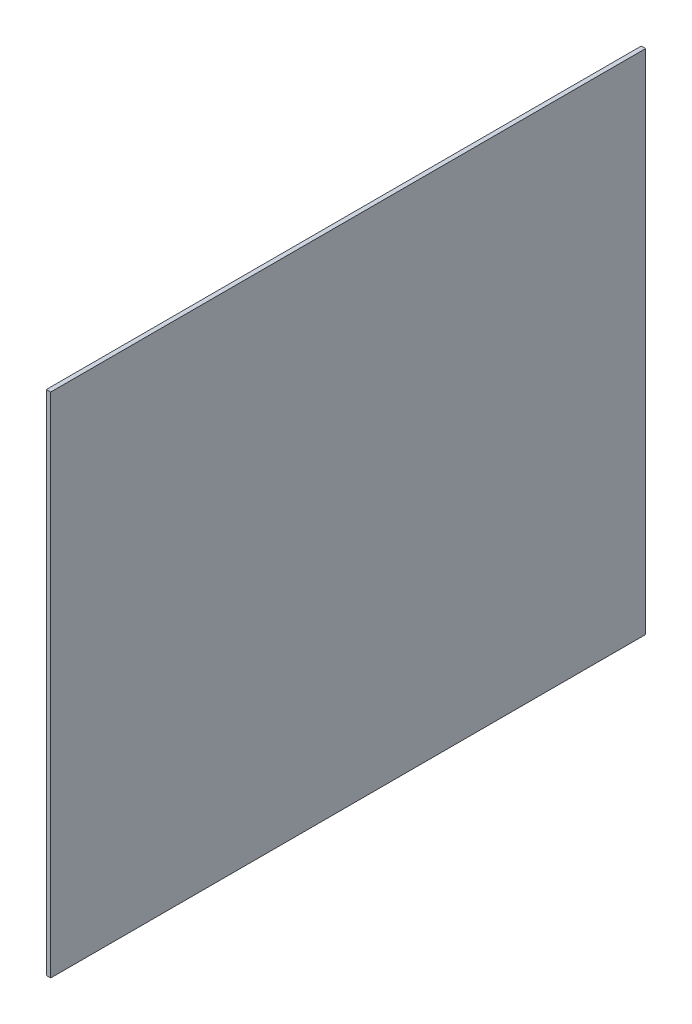
ISO-10303-21;
HEADER;
FILE_DESCRIPTION(('STEP AP214'),'2;1');
FILE_NAME('part.step','',(''),(''),'','','');
FILE_SCHEMA(('AUTOMOTIVE_DESIGN { 1 0 10303 214 1 1 1 1 }'));
ENDSEC;
DATA;
#1=APPLICATION_CONTEXT('core data for automotive mechanical design processes');
#2=APPLICATION_PROTOCOL_DEFINITION('international standard','automotive_design',2000,#1);
#3=PRODUCT_CONTEXT('',#1,'mechanical');
#4=PRODUCT('Part','Part','',(#3));
#5=PRODUCT_RELATED_PRODUCT_CATEGORY('part','',(#4));
#6=PRODUCT_DEFINITION_FORMATION('','',#4);
#7=PRODUCT_DEFINITION_CONTEXT('part definition',#1,'design');
#8=PRODUCT_DEFINITION('design','',#6,#7);
#9=PRODUCT_DEFINITION_SHAPE('','',#8);
#10=(LENGTH_UNIT() NAMED_UNIT(*) SI_UNIT(.MILLI.,.METRE.));
#11=(NAMED_UNIT(*) PLANE_ANGLE_UNIT() SI_UNIT($,.RADIAN.));
#12=(NAMED_UNIT(*) SI_UNIT($,.STERADIAN.) SOLID_ANGLE_UNIT());
#13=UNCERTAINTY_MEASURE_WITH_UNIT(LENGTH_MEASURE(1.E-05),#10,'distance_accuracy_value','');
#14=(GEOMETRIC_REPRESENTATION_CONTEXT(3) GLOBAL_UNCERTAINTY_ASSIGNED_CONTEXT((#13)) GLOBAL_UNIT_ASSIGNED_CONTEXT((#10,
#11,#12)) REPRESENTATION_CONTEXT('',''));
#15=CARTESIAN_POINT('',(0.,0.,0.));
#16=DIRECTION('',(0.,0.,1.));
#17=DIRECTION('',(1.,0.,0.));
#18=AXIS2_PLACEMENT_3D('',#15,#16,#17);
#19=CARTESIAN_POINT('',(1.58749999999997,184.15,431.8));
#20=DIRECTION('',(-1.,0.,0.));
#21=DIRECTION('',(0.,-1.,0.));
#22=AXIS2_PLACEMENT_3D('',#19,#20,#21);
#23=PLANE('',#22);
#24=DIRECTION('',(0.,1.,0.));
#25=VECTOR('',#24,1.);
#26=CARTESIAN_POINT('',(1.58749999999997,184.15,0.));
#27=LINE('',#26,#25);
#28=CARTESIAN_POINT('',(1.58750000000002,-184.15,0.));
#29=VERTEX_POINT('',#28);
#30=CARTESIAN_POINT('',(1.58749999999997,184.15,0.));
#31=VERTEX_POINT('',#30);
#32=EDGE_CURVE('E102',#29,#31,#27,.T.);
#33=ORIENTED_EDGE('',*,*,#32,.T.);
#34=DIRECTION('',(0.,0.,-1.));
#35=VECTOR('',#34,1.);
#36=CARTESIAN_POINT('',(1.58749999999997,184.15,431.8));
#37=LINE('',#36,#35);
#38=CARTESIAN_POINT('',(1.58749999999997,184.15,431.8));
#39=VERTEX_POINT('',#38);
#40=EDGE_CURVE('E11',#39,#31,#37,.T.);
#41=ORIENTED_EDGE('',*,*,#40,.F.);
#42=DIRECTION('',(0.,1.,0.));
#43=VECTOR('',#42,1.);
#44=CARTESIAN_POINT('',(1.58749999999997,184.15,431.8));
#45=LINE('',#44,#43);
#46=CARTESIAN_POINT('',(1.58750000000002,-184.15,431.8));
#47=VERTEX_POINT('',#46);
#48=EDGE_CURVE('E90',#47,#39,#45,.T.);
#49=ORIENTED_EDGE('',*,*,#48,.F.);
#50=DIRECTION('',(0.,0.,-1.));
#51=VECTOR('',#50,1.);
#52=CARTESIAN_POINT('',(1.58750000000002,-184.15,431.8));
#53=LINE('',#52,#51);
#54=EDGE_CURVE('E98',#47,#29,#53,.T.);
#55=ORIENTED_EDGE('',*,*,#54,.T.);
#56=EDGE_LOOP('',(#33,#41,#49,#55));
#57=FACE_BOUND('',#56,.T.);
#58=ADVANCED_FACE('F39',(#57),#23,.F.);
#59=CARTESIAN_POINT('',(-1.58750000000002,184.15,431.8));
#60=DIRECTION('',(0.,-1.,0.));
#61=DIRECTION('',(0.,0.,-1.));
#62=AXIS2_PLACEMENT_3D('',#59,#60,#61);
#63=PLANE('',#62);
#64=DIRECTION('',(-1.,0.,0.));
#65=VECTOR('',#64,1.);
#66=CARTESIAN_POINT('',(-1.58750000000002,184.15,0.));
#67=LINE('',#66,#65);
#68=CARTESIAN_POINT('',(-1.58750000000002,184.15,0.));
#69=VERTEX_POINT('',#68);
#70=EDGE_CURVE('E94',#31,#69,#67,.T.);
#71=ORIENTED_EDGE('',*,*,#70,.T.);
#72=DIRECTION('',(0.,0.,-1.));
#73=VECTOR('',#72,1.);
#74=CARTESIAN_POINT('',(-1.58750000000002,184.15,431.8));
#75=LINE('',#74,#73);
#76=CARTESIAN_POINT('',(-1.58750000000002,184.15,431.8));
#77=VERTEX_POINT('',#76);
#78=EDGE_CURVE('E47',#77,#69,#75,.T.);
#79=ORIENTED_EDGE('',*,*,#78,.F.);
#80=DIRECTION('',(-1.,0.,0.));
#81=VECTOR('',#80,1.);
#82=CARTESIAN_POINT('',(-1.58750000000002,184.15,431.8));
#83=LINE('',#82,#81);
#84=EDGE_CURVE('E85',#39,#77,#83,.T.);
#85=ORIENTED_EDGE('',*,*,#84,.F.);
#86=ORIENTED_EDGE('',*,*,#40,.T.);
#87=EDGE_LOOP('',(#71,#79,#85,#86));
#88=FACE_BOUND('',#87,.T.);
#89=ADVANCED_FACE('F93',(#88),#63,.F.);
#90=CARTESIAN_POINT('',(-1.58750000000002,184.15,431.8));
#91=DIRECTION('',(1.,0.,0.));
#92=DIRECTION('',(0.,1.,0.));
#93=AXIS2_PLACEMENT_3D('',#90,#91,#92);
#94=PLANE('',#93);
#95=DIRECTION('',(0.,-1.,0.));
#96=VECTOR('',#95,1.);
#97=CARTESIAN_POINT('',(-1.58750000000002,184.15,0.));
#98=LINE('',#97,#96);
#99=CARTESIAN_POINT('',(-1.58749999999998,-184.15,0.));
#100=VERTEX_POINT('',#99);
#101=EDGE_CURVE('E72',#69,#100,#98,.T.);
#102=ORIENTED_EDGE('',*,*,#101,.T.);
#103=DIRECTION('',(0.,0.,-1.));
#104=VECTOR('',#103,1.);
#105=CARTESIAN_POINT('',(-1.58749999999998,-184.15,431.8));
#106=LINE('',#105,#104);
#107=CARTESIAN_POINT('',(-1.58749999999998,-184.15,431.8));
#108=VERTEX_POINT('',#107);
#109=EDGE_CURVE('E95',#108,#100,#106,.T.);
#110=ORIENTED_EDGE('',*,*,#109,.F.);
#111=DIRECTION('',(0.,-1.,0.));
#112=VECTOR('',#111,1.);
#113=CARTESIAN_POINT('',(-1.58750000000002,184.15,431.8));
#114=LINE('',#113,#112);
#115=EDGE_CURVE('E88',#77,#108,#114,.T.);
#116=ORIENTED_EDGE('',*,*,#115,.F.);
#117=ORIENTED_EDGE('',*,*,#78,.T.);
#118=EDGE_LOOP('',(#102,#110,#116,#117));
#119=FACE_BOUND('',#118,.T.);
#120=ADVANCED_FACE('F96',(#119),#94,.F.);
#121=CARTESIAN_POINT('',(-1.58749999999998,-184.15,431.8));
#122=DIRECTION('',(0.,1.,0.));
#123=DIRECTION('',(-1.,0.,0.));
#124=AXIS2_PLACEMENT_3D('',#121,#122,#123);
#125=PLANE('',#124);
#126=DIRECTION('',(1.,0.,0.));
#127=VECTOR('',#126,1.);
#128=CARTESIAN_POINT('',(-1.58749999999998,-184.15,0.));
#129=LINE('',#128,#127);
#130=EDGE_CURVE('E78',#100,#29,#129,.T.);
#131=ORIENTED_EDGE('',*,*,#130,.T.);
#132=ORIENTED_EDGE('',*,*,#54,.F.);
#133=DIRECTION('',(1.,0.,0.));
#134=VECTOR('',#133,1.);
#135=CARTESIAN_POINT('',(-1.58749999999998,-184.15,431.8));
#136=LINE('',#135,#134);
#137=EDGE_CURVE('E55',#108,#47,#136,.T.);
#138=ORIENTED_EDGE('',*,*,#137,.F.);
#139=ORIENTED_EDGE('',*,*,#109,.T.);
#140=EDGE_LOOP('',(#131,#132,#138,#139));
#141=FACE_BOUND('',#140,.T.);
#142=ADVANCED_FACE('F109',(#141),#125,.F.);
#143=CARTESIAN_POINT('',(0.,0.,431.8));
#144=DIRECTION('',(0.,0.,1.));
#145=DIRECTION('',(1.,0.,0.));
#146=AXIS2_PLACEMENT_3D('',#143,#144,#145);
#147=PLANE('',#146);
#148=ORIENTED_EDGE('',*,*,#48,.T.);
#149=ORIENTED_EDGE('',*,*,#84,.T.);
#150=ORIENTED_EDGE('',*,*,#115,.T.);
#151=ORIENTED_EDGE('',*,*,#137,.T.);
#152=EDGE_LOOP('',(#148,#149,#150,#151));
#153=FACE_BOUND('',#152,.T.);
#154=ADVANCED_FACE('F86',(#153),#147,.T.);
#155=CARTESIAN_POINT('',(0.,0.,0.));
#156=DIRECTION('',(0.,0.,1.));
#157=DIRECTION('',(1.,0.,0.));
#158=AXIS2_PLACEMENT_3D('',#155,#156,#157);
#159=PLANE('',#158);
#160=ORIENTED_EDGE('',*,*,#32,.F.);
#161=ORIENTED_EDGE('',*,*,#130,.F.);
#162=ORIENTED_EDGE('',*,*,#101,.F.);
#163=ORIENTED_EDGE('',*,*,#70,.F.);
#164=EDGE_LOOP('',(#160,#161,#162,#163));
#165=FACE_BOUND('',#164,.T.);
#166=ADVANCED_FACE('F112',(#165),#159,.F.);
#167=CLOSED_SHELL('',(#58,#89,#120,#142,#154,#166));
#168=MANIFOLD_SOLID_BREP('B2',#167);
#169=ADVANCED_BREP_SHAPE_REPRESENTATION('',(#18,#168),#14);
#170=SHAPE_DEFINITION_REPRESENTATION(#9,#169);
ENDSEC;
END-ISO-10303-21;
